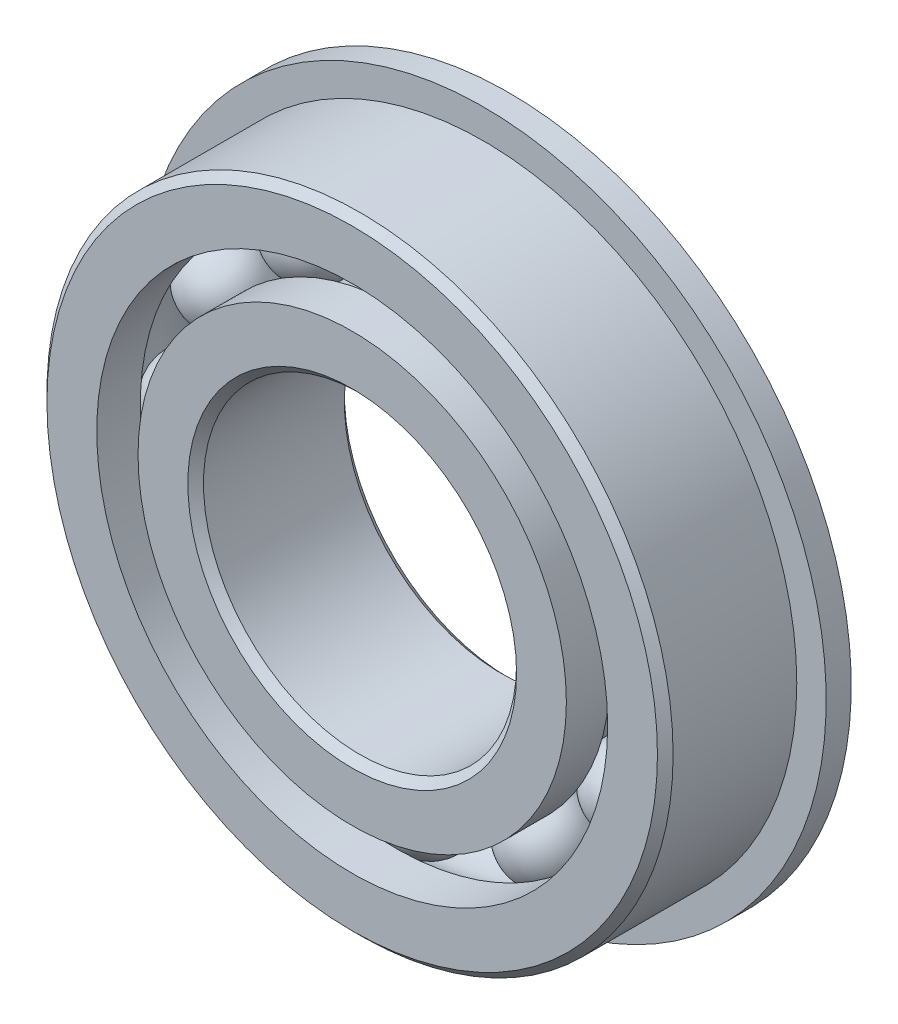
ISO-10303-21;
HEADER;
FILE_DESCRIPTION(('STEP AP214'),'2;1');
FILE_NAME('part.step','',(''),(''),'','','');
FILE_SCHEMA(('AUTOMOTIVE_DESIGN { 1 0 10303 214 1 1 1 1 }'));
ENDSEC;
DATA;
#1=APPLICATION_CONTEXT('core data for automotive mechanical design processes');
#2=APPLICATION_PROTOCOL_DEFINITION('international standard','automotive_design',2000,#1);
#3=PRODUCT_CONTEXT('',#1,'mechanical');
#4=PRODUCT('Part','Part','',(#3));
#5=PRODUCT_RELATED_PRODUCT_CATEGORY('part','',(#4));
#6=PRODUCT_DEFINITION_FORMATION('','',#4);
#7=PRODUCT_DEFINITION_CONTEXT('part definition',#1,'design');
#8=PRODUCT_DEFINITION('design','',#6,#7);
#9=PRODUCT_DEFINITION_SHAPE('','',#8);
#10=(LENGTH_UNIT() NAMED_UNIT(*) SI_UNIT(.MILLI.,.METRE.));
#11=(NAMED_UNIT(*) PLANE_ANGLE_UNIT() SI_UNIT($,.RADIAN.));
#12=(NAMED_UNIT(*) SI_UNIT($,.STERADIAN.) SOLID_ANGLE_UNIT());
#13=UNCERTAINTY_MEASURE_WITH_UNIT(LENGTH_MEASURE(1.E-05),#10,'distance_accuracy_value','');
#14=(GEOMETRIC_REPRESENTATION_CONTEXT(3) GLOBAL_UNCERTAINTY_ASSIGNED_CONTEXT((#13)) GLOBAL_UNIT_ASSIGNED_CONTEXT((#10,
#11,#12)) REPRESENTATION_CONTEXT('',''));
#15=CARTESIAN_POINT('',(0.,0.,0.));
#16=DIRECTION('',(0.,0.,1.));
#17=DIRECTION('',(1.,0.,0.));
#18=AXIS2_PLACEMENT_3D('',#15,#16,#17);
#19=CARTESIAN_POINT('',(-2.38124999999995,4.12444598552342,0.));
#20=DIRECTION('',(0.,0.,1.));
#21=DIRECTION('',(-0.499999999999989,0.866025403784445,0.));
#22=AXIS2_PLACEMENT_3D('',#19,#20,#21);
#23=SPHERICAL_SURFACE('',#22,0.820428356767389);
#24=CARTESIAN_POINT('',(-2.38124999999995,4.12444598552342,0.820428356767389));
#25=VERTEX_POINT('',#24);
#26=VERTEX_LOOP('',#25);
#27=FACE_BOUND('',#26,.T.);
#28=ADVANCED_FACE('F37',(#27),#23,.T.);
#29=CLOSED_SHELL('',(#28));
#30=MANIFOLD_SOLID_BREP('B2',#29);
#31=CARTESIAN_POINT('',(-4.12444598552336,2.38125000000005,0.));
#32=DIRECTION('',(0.,0.,1.));
#33=DIRECTION('',(-0.866025403784433,0.50000000000001,0.));
#34=AXIS2_PLACEMENT_3D('',#31,#32,#33);
#35=SPHERICAL_SURFACE('',#34,0.820428356767389);
#36=CARTESIAN_POINT('',(-4.12444598552336,2.38125000000005,0.820428356767389));
#37=VERTEX_POINT('',#36);
#38=VERTEX_LOOP('',#37);
#39=FACE_BOUND('',#38,.T.);
#40=ADVANCED_FACE('F57',(#39),#35,.T.);
#41=CLOSED_SHELL('',(#40));
#42=MANIFOLD_SOLID_BREP('B6',#41);
#43=CARTESIAN_POINT('',(-4.7625,0.,0.));
#44=DIRECTION('',(0.,0.,1.));
#45=DIRECTION('',(-1.,0.,0.));
#46=AXIS2_PLACEMENT_3D('',#43,#44,#45);
#47=SPHERICAL_SURFACE('',#46,0.820428356767389);
#48=CARTESIAN_POINT('',(-4.7625,0.,0.820428356767389));
#49=VERTEX_POINT('',#48);
#50=VERTEX_LOOP('',#49);
#51=FACE_BOUND('',#50,.T.);
#52=ADVANCED_FACE('F77',(#51),#47,.T.);
#53=CLOSED_SHELL('',(#52));
#54=MANIFOLD_SOLID_BREP('B33',#53);
#55=CARTESIAN_POINT('',(-4.12444598552341,-2.38124999999996,0.));
#56=DIRECTION('',(0.,0.,1.));
#57=DIRECTION('',(-0.866025403784443,-0.499999999999992,0.));
#58=AXIS2_PLACEMENT_3D('',#55,#56,#57);
#59=SPHERICAL_SURFACE('',#58,0.820428356767389);
#60=CARTESIAN_POINT('',(-4.12444598552341,-2.38124999999996,0.820428356767389));
#61=VERTEX_POINT('',#60);
#62=VERTEX_LOOP('',#61);
#63=FACE_BOUND('',#62,.T.);
#64=ADVANCED_FACE('F97',(#63),#59,.T.);
#65=CLOSED_SHELL('',(#64));
#66=MANIFOLD_SOLID_BREP('B53',#65);
#67=CARTESIAN_POINT('',(-2.38125000000003,-4.12444598552337,0.));
#68=DIRECTION('',(0.,0.,1.));
#69=DIRECTION('',(-0.500000000000007,-0.866025403784435,0.));
#70=AXIS2_PLACEMENT_3D('',#67,#68,#69);
#71=SPHERICAL_SURFACE('',#70,0.820428356767389);
#72=CARTESIAN_POINT('',(-2.38125000000003,-4.12444598552337,0.820428356767389));
#73=VERTEX_POINT('',#72);
#74=VERTEX_LOOP('',#73);
#75=FACE_BOUND('',#74,.T.);
#76=ADVANCED_FACE('F117',(#75),#71,.T.);
#77=CLOSED_SHELL('',(#76));
#78=MANIFOLD_SOLID_BREP('B73',#77);
#79=CARTESIAN_POINT('',(0.,-4.7625,0.));
#80=DIRECTION('',(0.,0.,1.));
#81=DIRECTION('',(0.,-1.,0.));
#82=AXIS2_PLACEMENT_3D('',#79,#80,#81);
#83=SPHERICAL_SURFACE('',#82,0.820428356767389);
#84=CARTESIAN_POINT('',(0.,-4.7625,0.820428356767389));
#85=VERTEX_POINT('',#84);
#86=VERTEX_LOOP('',#85);
#87=FACE_BOUND('',#86,.T.);
#88=ADVANCED_FACE('F137',(#87),#83,.T.);
#89=CLOSED_SHELL('',(#88));
#90=MANIFOLD_SOLID_BREP('B93',#89);
#91=CARTESIAN_POINT('',(2.38124999999998,-4.1244459855234,0.));
#92=DIRECTION('',(0.,0.,1.));
#93=DIRECTION('',(0.499999999999995,-0.866025403784442,0.));
#94=AXIS2_PLACEMENT_3D('',#91,#92,#93);
#95=SPHERICAL_SURFACE('',#94,0.820428356767389);
#96=CARTESIAN_POINT('',(2.38124999999998,-4.1244459855234,0.820428356767389));
#97=VERTEX_POINT('',#96);
#98=VERTEX_LOOP('',#97);
#99=FACE_BOUND('',#98,.T.);
#100=ADVANCED_FACE('F157',(#99),#95,.T.);
#101=CLOSED_SHELL('',(#100));
#102=MANIFOLD_SOLID_BREP('B113',#101);
#103=CARTESIAN_POINT('',(4.12444598552338,-2.38125000000002,0.));
#104=DIRECTION('',(0.,0.,1.));
#105=DIRECTION('',(0.866025403784436,-0.500000000000004,0.));
#106=AXIS2_PLACEMENT_3D('',#103,#104,#105);
#107=SPHERICAL_SURFACE('',#106,0.820428356767389);
#108=CARTESIAN_POINT('',(4.12444598552338,-2.38125000000002,0.820428356767389));
#109=VERTEX_POINT('',#108);
#110=VERTEX_LOOP('',#109);
#111=FACE_BOUND('',#110,.T.);
#112=ADVANCED_FACE('F177',(#111),#107,.T.);
#113=CLOSED_SHELL('',(#112));
#114=MANIFOLD_SOLID_BREP('B133',#113);
#115=CARTESIAN_POINT('',(4.7625,0.,0.));
#116=DIRECTION('',(0.,0.,1.));
#117=DIRECTION('',(1.,0.,0.));
#118=AXIS2_PLACEMENT_3D('',#115,#116,#117);
#119=SPHERICAL_SURFACE('',#118,0.820428356767389);
#120=CARTESIAN_POINT('',(4.7625,0.,0.820428356767389));
#121=VERTEX_POINT('',#120);
#122=VERTEX_LOOP('',#121);
#123=FACE_BOUND('',#122,.T.);
#124=ADVANCED_FACE('F197',(#123),#119,.T.);
#125=CLOSED_SHELL('',(#124));
#126=MANIFOLD_SOLID_BREP('B153',#125);
#127=CARTESIAN_POINT('',(4.12444598552339,2.38124999999999,0.));
#128=DIRECTION('',(0.,0.,1.));
#129=DIRECTION('',(0.86602540378444,0.499999999999998,0.));
#130=AXIS2_PLACEMENT_3D('',#127,#128,#129);
#131=SPHERICAL_SURFACE('',#130,0.820428356767389);
#132=CARTESIAN_POINT('',(4.12444598552339,2.38124999999999,0.820428356767389));
#133=VERTEX_POINT('',#132);
#134=VERTEX_LOOP('',#133);
#135=FACE_BOUND('',#134,.T.);
#136=ADVANCED_FACE('F217',(#135),#131,.T.);
#137=CLOSED_SHELL('',(#136));
#138=MANIFOLD_SOLID_BREP('B173',#137);
#139=CARTESIAN_POINT('',(2.38125,4.12444598552339,0.));
#140=DIRECTION('',(0.,0.,1.));
#141=DIRECTION('',(0.500000000000001,0.866025403784438,0.));
#142=AXIS2_PLACEMENT_3D('',#139,#140,#141);
#143=SPHERICAL_SURFACE('',#142,0.820428356767389);
#144=CARTESIAN_POINT('',(2.38125,4.12444598552339,0.820428356767389));
#145=VERTEX_POINT('',#144);
#146=VERTEX_LOOP('',#145);
#147=FACE_BOUND('',#146,.T.);
#148=ADVANCED_FACE('F237',(#147),#143,.T.);
#149=CLOSED_SHELL('',(#148));
#150=MANIFOLD_SOLID_BREP('B193',#149);
#151=CARTESIAN_POINT('',(0.,4.7625,0.));
#152=DIRECTION('',(0.,0.,1.));
#153=DIRECTION('',(0.,1.,0.));
#154=AXIS2_PLACEMENT_3D('',#151,#152,#153);
#155=SPHERICAL_SURFACE('',#154,0.820428356767389);
#156=CARTESIAN_POINT('',(0.,4.7625,0.820428356767389));
#157=VERTEX_POINT('',#156);
#158=VERTEX_LOOP('',#157);
#159=FACE_BOUND('',#158,.T.);
#160=ADVANCED_FACE('F259',(#159),#155,.T.);
#161=CLOSED_SHELL('',(#160));
#162=MANIFOLD_SOLID_BREP('B213',#161);
#163=CARTESIAN_POINT('',(0.,4.34381868131868,1.5875));
#164=DIRECTION('',(0.,0.,-1.));
#165=DIRECTION('',(-1.,0.,0.));
#166=AXIS2_PLACEMENT_3D('',#163,#164,#165);
#167=PLANE('',#166);
#168=CARTESIAN_POINT('',(0.,0.,1.5875));
#169=DIRECTION('',(0.,0.,1.));
#170=DIRECTION('',(1.,0.,0.));
#171=AXIS2_PLACEMENT_3D('',#168,#169,#170);
#172=CIRCLE('',#171,3.33375);
#173=CARTESIAN_POINT('',(3.33375,0.,1.5875));
#174=VERTEX_POINT('',#173);
#175=EDGE_CURVE('E306',#174,#174,#172,.T.);
#176=ORIENTED_EDGE('',*,*,#175,.F.);
#177=EDGE_LOOP('',(#176));
#178=FACE_BOUND('',#177,.T.);
#179=CARTESIAN_POINT('',(0.,0.,1.5875));
#180=DIRECTION('',(0.,0.,1.));
#181=DIRECTION('',(1.,0.,0.));
#182=AXIS2_PLACEMENT_3D('',#179,#180,#181);
#183=CIRCLE('',#182,4.34381868131868);
#184=CARTESIAN_POINT('',(4.34381868131868,0.,1.5875));
#185=VERTEX_POINT('',#184);
#186=EDGE_CURVE('E258',#185,#185,#183,.T.);
#187=ORIENTED_EDGE('',*,*,#186,.T.);
#188=EDGE_LOOP('',(#187));
#189=FACE_BOUND('',#188,.T.);
#190=ADVANCED_FACE('F278',(#178,#189),#167,.F.);
#191=CARTESIAN_POINT('',(0.,0.,1.5875));
#192=DIRECTION('',(0.,0.,1.));
#193=DIRECTION('',(1.,0.,0.));
#194=AXIS2_PLACEMENT_3D('',#191,#192,#193);
#195=CYLINDRICAL_SURFACE('',#194,4.34381868131868);
#196=ORIENTED_EDGE('',*,*,#186,.F.);
#197=EDGE_LOOP('',(#196));
#198=FACE_BOUND('',#197,.T.);
#199=CARTESIAN_POINT('',(0.,0.,0.705555555555556));
#200=DIRECTION('',(0.,0.,1.));
#201=DIRECTION('',(1.,0.,0.));
#202=AXIS2_PLACEMENT_3D('',#199,#200,#201);
#203=CIRCLE('',#202,4.34381868131868);
#204=CARTESIAN_POINT('',(4.34381868131868,0.,0.705555555555556));
#205=VERTEX_POINT('',#204);
#206=EDGE_CURVE('E284',#205,#205,#203,.T.);
#207=ORIENTED_EDGE('',*,*,#206,.T.);
#208=EDGE_LOOP('',(#207));
#209=FACE_BOUND('',#208,.T.);
#210=ADVANCED_FACE('F313',(#198,#209),#195,.T.);
#211=CARTESIAN_POINT('',(0.,0.,0.));
#212=DIRECTION('',(0.,0.,1.));
#213=DIRECTION('',(1.,0.,0.));
#214=AXIS2_PLACEMENT_3D('',#211,#212,#213);
#215=TOROIDAL_SURFACE('',#214,4.7625,0.820428356767387);
#216=ORIENTED_EDGE('',*,*,#206,.F.);
#217=EDGE_LOOP('',(#216));
#218=FACE_BOUND('',#217,.T.);
#219=CARTESIAN_POINT('',(0.,0.,-0.705555555555556));
#220=DIRECTION('',(0.,0.,1.));
#221=DIRECTION('',(1.,0.,0.));
#222=AXIS2_PLACEMENT_3D('',#219,#220,#221);
#223=CIRCLE('',#222,4.34381868131868);
#224=CARTESIAN_POINT('',(4.34381868131868,0.,-0.705555555555556));
#225=VERTEX_POINT('',#224);
#226=EDGE_CURVE('E288',#225,#225,#223,.T.);
#227=ORIENTED_EDGE('',*,*,#226,.T.);
#228=EDGE_LOOP('',(#227));
#229=FACE_BOUND('',#228,.T.);
#230=ADVANCED_FACE('F317',(#218,#229),#215,.F.);
#231=CARTESIAN_POINT('',(0.,0.,1.5875));
#232=DIRECTION('',(0.,0.,1.));
#233=DIRECTION('',(1.,0.,0.));
#234=AXIS2_PLACEMENT_3D('',#231,#232,#233);
#235=CYLINDRICAL_SURFACE('',#234,4.34381868131868);
#236=ORIENTED_EDGE('',*,*,#226,.F.);
#237=EDGE_LOOP('',(#236));
#238=FACE_BOUND('',#237,.T.);
#239=CARTESIAN_POINT('',(0.,0.,-1.5875));
#240=DIRECTION('',(0.,0.,1.));
#241=DIRECTION('',(1.,0.,0.));
#242=AXIS2_PLACEMENT_3D('',#239,#240,#241);
#243=CIRCLE('',#242,4.34381868131868);
#244=CARTESIAN_POINT('',(4.34381868131868,0.,-1.5875));
#245=VERTEX_POINT('',#244);
#246=EDGE_CURVE('E292',#245,#245,#243,.T.);
#247=ORIENTED_EDGE('',*,*,#246,.T.);
#248=EDGE_LOOP('',(#247));
#249=FACE_BOUND('',#248,.T.);
#250=ADVANCED_FACE('F322',(#238,#249),#235,.T.);
#251=CARTESIAN_POINT('',(0.,3.33375,-1.5875));
#252=DIRECTION('',(0.,0.,1.));
#253=DIRECTION('',(1.,0.,0.));
#254=AXIS2_PLACEMENT_3D('',#251,#252,#253);
#255=PLANE('',#254);
#256=ORIENTED_EDGE('',*,*,#246,.F.);
#257=EDGE_LOOP('',(#256));
#258=FACE_BOUND('',#257,.T.);
#259=CARTESIAN_POINT('',(0.,0.,-1.5875));
#260=DIRECTION('',(0.,0.,1.));
#261=DIRECTION('',(1.,0.,0.));
#262=AXIS2_PLACEMENT_3D('',#259,#260,#261);
#263=CIRCLE('',#262,3.33375);
#264=CARTESIAN_POINT('',(3.33375,0.,-1.5875));
#265=VERTEX_POINT('',#264);
#266=EDGE_CURVE('E297',#265,#265,#263,.T.);
#267=ORIENTED_EDGE('',*,*,#266,.T.);
#268=EDGE_LOOP('',(#267));
#269=FACE_BOUND('',#268,.T.);
#270=ADVANCED_FACE('F328',(#258,#269),#255,.F.);
#271=CARTESIAN_POINT('',(0.,0.,-1.42875));
#272=DIRECTION('',(0.,0.,-1.));
#273=DIRECTION('',(-1.,0.,0.));
#274=AXIS2_PLACEMENT_3D('',#271,#272,#273);
#275=CONICAL_SURFACE('',#274,3.175,0.785398163397446);
#276=ORIENTED_EDGE('',*,*,#266,.F.);
#277=EDGE_LOOP('',(#276));
#278=FACE_BOUND('',#277,.T.);
#279=CARTESIAN_POINT('',(0.,0.,-1.42875));
#280=DIRECTION('',(0.,0.,1.));
#281=DIRECTION('',(1.,0.,0.));
#282=AXIS2_PLACEMENT_3D('',#279,#280,#281);
#283=CIRCLE('',#282,3.175);
#284=CARTESIAN_POINT('',(3.175,0.,-1.42875));
#285=VERTEX_POINT('',#284);
#286=EDGE_CURVE('E300',#285,#285,#283,.T.);
#287=ORIENTED_EDGE('',*,*,#286,.T.);
#288=EDGE_LOOP('',(#287));
#289=FACE_BOUND('',#288,.T.);
#290=ADVANCED_FACE('F332',(#278,#289),#275,.F.);
#291=CARTESIAN_POINT('',(0.,0.,1.5875));
#292=DIRECTION('',(0.,0.,1.));
#293=DIRECTION('',(1.,0.,0.));
#294=AXIS2_PLACEMENT_3D('',#291,#292,#293);
#295=CYLINDRICAL_SURFACE('',#294,3.175);
#296=ORIENTED_EDGE('',*,*,#286,.F.);
#297=EDGE_LOOP('',(#296));
#298=FACE_BOUND('',#297,.T.);
#299=CARTESIAN_POINT('',(0.,0.,1.42875));
#300=DIRECTION('',(0.,0.,1.));
#301=DIRECTION('',(1.,0.,0.));
#302=AXIS2_PLACEMENT_3D('',#299,#300,#301);
#303=CIRCLE('',#302,3.175);
#304=CARTESIAN_POINT('',(3.175,0.,1.42875));
#305=VERTEX_POINT('',#304);
#306=EDGE_CURVE('E303',#305,#305,#303,.T.);
#307=ORIENTED_EDGE('',*,*,#306,.T.);
#308=EDGE_LOOP('',(#307));
#309=FACE_BOUND('',#308,.T.);
#310=ADVANCED_FACE('F336',(#298,#309),#295,.F.);
#311=CARTESIAN_POINT('',(0.,0.,1.5875));
#312=DIRECTION('',(0.,0.,1.));
#313=DIRECTION('',(1.,0.,0.));
#314=AXIS2_PLACEMENT_3D('',#311,#312,#313);
#315=CONICAL_SURFACE('',#314,3.33375,0.785398163397452);
#316=ORIENTED_EDGE('',*,*,#306,.F.);
#317=EDGE_LOOP('',(#316));
#318=FACE_BOUND('',#317,.T.);
#319=ORIENTED_EDGE('',*,*,#175,.T.);
#320=EDGE_LOOP('',(#319));
#321=FACE_BOUND('',#320,.T.);
#322=ADVANCED_FACE('F310',(#318,#321),#315,.F.);
#323=CLOSED_SHELL('',(#190,#210,#230,#250,#270,#290,#310,#322));
#324=MANIFOLD_SOLID_BREP('B233',#323);
#325=CARTESIAN_POINT('',(0.,0.,1.42875));
#326=DIRECTION('',(0.,0.,-1.));
#327=DIRECTION('',(-1.,0.,0.));
#328=AXIS2_PLACEMENT_3D('',#325,#326,#327);
#329=CONICAL_SURFACE('',#328,6.35,0.785398163397446);
#330=CARTESIAN_POINT('',(0.,0.,1.5875));
#331=DIRECTION('',(0.,0.,1.));
#332=DIRECTION('',(1.,0.,0.));
#333=AXIS2_PLACEMENT_3D('',#330,#331,#332);
#334=CIRCLE('',#333,6.19125);
#335=CARTESIAN_POINT('',(6.19125,0.,1.5875));
#336=VERTEX_POINT('',#335);
#337=EDGE_CURVE('E421',#336,#336,#334,.T.);
#338=ORIENTED_EDGE('',*,*,#337,.F.);
#339=EDGE_LOOP('',(#338));
#340=FACE_BOUND('',#339,.T.);
#341=CARTESIAN_POINT('',(0.,0.,1.42875));
#342=DIRECTION('',(0.,0.,1.));
#343=DIRECTION('',(1.,0.,0.));
#344=AXIS2_PLACEMENT_3D('',#341,#342,#343);
#345=CIRCLE('',#344,6.35);
#346=CARTESIAN_POINT('',(6.35,0.,1.42875));
#347=VERTEX_POINT('',#346);
#348=EDGE_CURVE('E277',#347,#347,#345,.T.);
#349=ORIENTED_EDGE('',*,*,#348,.T.);
#350=EDGE_LOOP('',(#349));
#351=FACE_BOUND('',#350,.T.);
#352=ADVANCED_FACE('F399',(#340,#351),#329,.T.);
#353=CARTESIAN_POINT('',(0.,0.,1.5875));
#354=DIRECTION('',(0.,0.,1.));
#355=DIRECTION('',(1.,0.,0.));
#356=AXIS2_PLACEMENT_3D('',#353,#354,#355);
#357=CYLINDRICAL_SURFACE('',#356,6.35);
#358=CARTESIAN_POINT('',(0.,0.,-1.0795));
#359=DIRECTION('',(0.,0.,1.));
#360=DIRECTION('',(1.,0.,0.));
#361=AXIS2_PLACEMENT_3D('',#358,#359,#360);
#362=CIRCLE('',#361,6.35);
#363=CARTESIAN_POINT('',(6.35,0.,-1.0795));
#364=VERTEX_POINT('',#363);
#365=EDGE_CURVE('E424',#364,#364,#362,.T.);
#366=ORIENTED_EDGE('',*,*,#365,.T.);
#367=EDGE_LOOP('',(#366));
#368=FACE_BOUND('',#367,.T.);
#369=ORIENTED_EDGE('',*,*,#348,.F.);
#370=EDGE_LOOP('',(#369));
#371=FACE_BOUND('',#370,.T.);
#372=ADVANCED_FACE('F444',(#368,#371),#357,.T.);
#373=CARTESIAN_POINT('',(0.,6.19125,-1.5875));
#374=DIRECTION('',(0.,0.,1.));
#375=DIRECTION('',(1.,0.,0.));
#376=AXIS2_PLACEMENT_3D('',#373,#374,#375);
#377=PLANE('',#376);
#378=CARTESIAN_POINT('',(0.,0.,-1.5875));
#379=DIRECTION('',(0.,0.,1.));
#380=DIRECTION('',(1.,0.,0.));
#381=AXIS2_PLACEMENT_3D('',#378,#379,#380);
#382=CIRCLE('',#381,5.18118131868132);
#383=CARTESIAN_POINT('',(5.18118131868132,0.,-1.5875));
#384=VERTEX_POINT('',#383);
#385=EDGE_CURVE('E405',#384,#384,#382,.T.);
#386=ORIENTED_EDGE('',*,*,#385,.T.);
#387=EDGE_LOOP('',(#386));
#388=FACE_BOUND('',#387,.T.);
#389=CARTESIAN_POINT('',(0.,0.,-1.5875));
#390=DIRECTION('',(0.,0.,-1.));
#391=DIRECTION('',(-1.,0.,0.));
#392=AXIS2_PLACEMENT_3D('',#389,#390,#391);
#393=CIRCLE('',#392,6.9469);
#394=CARTESIAN_POINT('',(-6.9469,0.,-1.5875));
#395=VERTEX_POINT('',#394);
#396=EDGE_CURVE('E427',#395,#395,#393,.T.);
#397=ORIENTED_EDGE('',*,*,#396,.T.);
#398=EDGE_LOOP('',(#397));
#399=FACE_BOUND('',#398,.T.);
#400=ADVANCED_FACE('F447',(#388,#399),#377,.F.);
#401=CARTESIAN_POINT('',(0.,0.,1.5875));
#402=DIRECTION('',(0.,0.,1.));
#403=DIRECTION('',(1.,0.,0.));
#404=AXIS2_PLACEMENT_3D('',#401,#402,#403);
#405=CYLINDRICAL_SURFACE('',#404,5.18118131868132);
#406=CARTESIAN_POINT('',(0.,0.,-0.705555555555555));
#407=DIRECTION('',(0.,0.,1.));
#408=DIRECTION('',(1.,0.,0.));
#409=AXIS2_PLACEMENT_3D('',#406,#407,#408);
#410=CIRCLE('',#409,5.18118131868132);
#411=CARTESIAN_POINT('',(5.18118131868132,0.,-0.705555555555555));
#412=VERTEX_POINT('',#411);
#413=EDGE_CURVE('E409',#412,#412,#410,.T.);
#414=ORIENTED_EDGE('',*,*,#413,.T.);
#415=EDGE_LOOP('',(#414));
#416=FACE_BOUND('',#415,.T.);
#417=ORIENTED_EDGE('',*,*,#385,.F.);
#418=EDGE_LOOP('',(#417));
#419=FACE_BOUND('',#418,.T.);
#420=ADVANCED_FACE('F452',(#416,#419),#405,.F.);
#421=CARTESIAN_POINT('',(0.,0.,0.));
#422=DIRECTION('',(0.,0.,1.));
#423=DIRECTION('',(1.,0.,0.));
#424=AXIS2_PLACEMENT_3D('',#421,#422,#423);
#425=TOROIDAL_SURFACE('',#424,4.7625,0.820428356767389);
#426=ORIENTED_EDGE('',*,*,#413,.F.);
#427=EDGE_LOOP('',(#426));
#428=FACE_BOUND('',#427,.T.);
#429=CARTESIAN_POINT('',(0.,0.,0.705555555555556));
#430=DIRECTION('',(0.,0.,1.));
#431=DIRECTION('',(1.,0.,0.));
#432=AXIS2_PLACEMENT_3D('',#429,#430,#431);
#433=CIRCLE('',#432,5.18118131868132);
#434=CARTESIAN_POINT('',(5.18118131868132,0.,0.705555555555556));
#435=VERTEX_POINT('',#434);
#436=EDGE_CURVE('E413',#435,#435,#433,.T.);
#437=ORIENTED_EDGE('',*,*,#436,.T.);
#438=EDGE_LOOP('',(#437));
#439=FACE_BOUND('',#438,.T.);
#440=ADVANCED_FACE('F458',(#428,#439),#425,.F.);
#441=CARTESIAN_POINT('',(0.,0.,1.5875));
#442=DIRECTION('',(0.,0.,1.));
#443=DIRECTION('',(1.,0.,0.));
#444=AXIS2_PLACEMENT_3D('',#441,#442,#443);
#445=CYLINDRICAL_SURFACE('',#444,5.18118131868132);
#446=ORIENTED_EDGE('',*,*,#436,.F.);
#447=EDGE_LOOP('',(#446));
#448=FACE_BOUND('',#447,.T.);
#449=CARTESIAN_POINT('',(0.,0.,1.5875));
#450=DIRECTION('',(0.,0.,1.));
#451=DIRECTION('',(1.,0.,0.));
#452=AXIS2_PLACEMENT_3D('',#449,#450,#451);
#453=CIRCLE('',#452,5.18118131868132);
#454=CARTESIAN_POINT('',(5.18118131868132,0.,1.5875));
#455=VERTEX_POINT('',#454);
#456=EDGE_CURVE('E418',#455,#455,#453,.T.);
#457=ORIENTED_EDGE('',*,*,#456,.T.);
#458=EDGE_LOOP('',(#457));
#459=FACE_BOUND('',#458,.T.);
#460=ADVANCED_FACE('F462',(#448,#459),#445,.F.);
#461=CARTESIAN_POINT('',(0.,6.19125,1.5875));
#462=DIRECTION('',(0.,0.,-1.));
#463=DIRECTION('',(-1.,0.,0.));
#464=AXIS2_PLACEMENT_3D('',#461,#462,#463);
#465=PLANE('',#464);
#466=ORIENTED_EDGE('',*,*,#456,.F.);
#467=EDGE_LOOP('',(#466));
#468=FACE_BOUND('',#467,.T.);
#469=ORIENTED_EDGE('',*,*,#337,.T.);
#470=EDGE_LOOP('',(#469));
#471=FACE_BOUND('',#470,.T.);
#472=ADVANCED_FACE('F440',(#468,#471),#465,.F.);
#473=CARTESIAN_POINT('',(0.,5.18118131868132,-1.0795));
#474=DIRECTION('',(0.,0.,1.));
#475=DIRECTION('',(1.,0.,0.));
#476=AXIS2_PLACEMENT_3D('',#473,#474,#475);
#477=PLANE('',#476);
#478=CARTESIAN_POINT('',(0.,0.,-1.0795));
#479=DIRECTION('',(0.,0.,-1.));
#480=DIRECTION('',(-1.,0.,0.));
#481=AXIS2_PLACEMENT_3D('',#478,#479,#480);
#482=CIRCLE('',#481,6.9469);
#483=CARTESIAN_POINT('',(-6.9469,0.,-1.0795));
#484=VERTEX_POINT('',#483);
#485=EDGE_CURVE('E430',#484,#484,#482,.T.);
#486=ORIENTED_EDGE('',*,*,#485,.F.);
#487=EDGE_LOOP('',(#486));
#488=FACE_BOUND('',#487,.T.);
#489=ORIENTED_EDGE('',*,*,#365,.F.);
#490=EDGE_LOOP('',(#489));
#491=FACE_BOUND('',#490,.T.);
#492=ADVANCED_FACE('F437',(#488,#491),#477,.T.);
#493=CARTESIAN_POINT('',(0.,0.,-1.5875));
#494=DIRECTION('',(0.,0.,-1.));
#495=DIRECTION('',(-1.,0.,0.));
#496=AXIS2_PLACEMENT_3D('',#493,#494,#495);
#497=CYLINDRICAL_SURFACE('',#496,6.9469);
#498=ORIENTED_EDGE('',*,*,#485,.T.);
#499=EDGE_LOOP('',(#498));
#500=FACE_BOUND('',#499,.T.);
#501=ORIENTED_EDGE('',*,*,#396,.F.);
#502=EDGE_LOOP('',(#501));
#503=FACE_BOUND('',#502,.T.);
#504=ADVANCED_FACE('F434',(#500,#503),#497,.T.);
#505=CLOSED_SHELL('',(#352,#372,#400,#420,#440,#460,#472,#492,#504));
#506=MANIFOLD_SOLID_BREP('B253',#505);
#507=ADVANCED_BREP_SHAPE_REPRESENTATION('',(#18,#30,#42,#54,#66,#78,#90,#102,#114,#126,#138,
#150,#162,#324,#506),#14);
#508=SHAPE_DEFINITION_REPRESENTATION(#9,#507);
ENDSEC;
END-ISO-10303-21;
